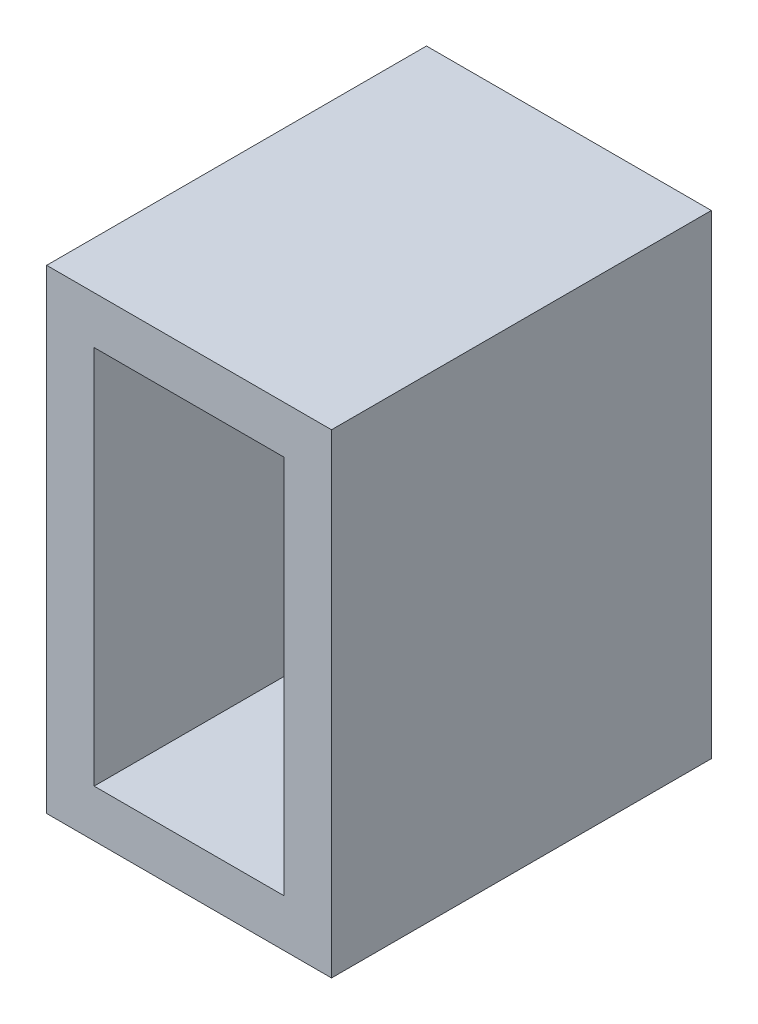
ISO-10303-21;
HEADER;
FILE_DESCRIPTION(('STEP AP214'),'2;1');
FILE_NAME('part.step','',(''),(''),'','','');
FILE_SCHEMA(('AUTOMOTIVE_DESIGN { 1 0 10303 214 1 1 1 1 }'));
ENDSEC;
DATA;
#1=APPLICATION_CONTEXT('core data for automotive mechanical design processes');
#2=APPLICATION_PROTOCOL_DEFINITION('international standard','automotive_design',2000,#1);
#3=PRODUCT_CONTEXT('',#1,'mechanical');
#4=PRODUCT('Part','Part','',(#3));
#5=PRODUCT_RELATED_PRODUCT_CATEGORY('part','',(#4));
#6=PRODUCT_DEFINITION_FORMATION('','',#4);
#7=PRODUCT_DEFINITION_CONTEXT('part definition',#1,'design');
#8=PRODUCT_DEFINITION('design','',#6,#7);
#9=PRODUCT_DEFINITION_SHAPE('','',#8);
#10=(LENGTH_UNIT() NAMED_UNIT(*) SI_UNIT(.MILLI.,.METRE.));
#11=(NAMED_UNIT(*) PLANE_ANGLE_UNIT() SI_UNIT($,.RADIAN.));
#12=(NAMED_UNIT(*) SI_UNIT($,.STERADIAN.) SOLID_ANGLE_UNIT());
#13=UNCERTAINTY_MEASURE_WITH_UNIT(LENGTH_MEASURE(1.E-05),#10,'distance_accuracy_value','');
#14=(GEOMETRIC_REPRESENTATION_CONTEXT(3) GLOBAL_UNCERTAINTY_ASSIGNED_CONTEXT((#13)) GLOBAL_UNIT_ASSIGNED_CONTEXT((#10,
#11,#12)) REPRESENTATION_CONTEXT('',''));
#15=CARTESIAN_POINT('',(0.,0.,0.));
#16=DIRECTION('',(0.,0.,1.));
#17=DIRECTION('',(1.,0.,0.));
#18=AXIS2_PLACEMENT_3D('',#15,#16,#17);
#19=CARTESIAN_POINT('',(0.,0.,5.588));
#20=DIRECTION('',(0.,0.,-1.));
#21=DIRECTION('',(-1.,0.,0.));
#22=AXIS2_PLACEMENT_3D('',#19,#20,#21);
#23=PLANE('',#22);
#24=DIRECTION('',(0.,1.,0.));
#25=VECTOR('',#24,1.);
#26=CARTESIAN_POINT('',(2.83827178729691,-27.627658788774,5.588));
#27=LINE('',#26,#25);
#28=CARTESIAN_POINT('',(2.83827178729691,-27.627658788774,5.588));
#29=VERTEX_POINT('',#28);
#30=CARTESIAN_POINT('',(2.83827178729691,-22.166658788774,5.588));
#31=VERTEX_POINT('',#30);
#32=EDGE_CURVE('E427',#29,#31,#27,.T.);
#33=ORIENTED_EDGE('',*,*,#32,.F.);
#34=DIRECTION('',(-1.,0.,0.));
#35=VECTOR('',#34,1.);
#36=CARTESIAN_POINT('',(0.,-27.627658788774,5.588));
#37=LINE('',#36,#35);
#38=CARTESIAN_POINT('',(-5.67072821270309,-27.627658788774,5.588));
#39=VERTEX_POINT('',#38);
#40=EDGE_CURVE('E264',#29,#39,#37,.T.);
#41=ORIENTED_EDGE('',*,*,#40,.T.);
#42=DIRECTION('',(0.,-1.,0.));
#43=VECTOR('',#42,1.);
#44=CARTESIAN_POINT('',(-5.67072821270309,-27.627658788774,5.588));
#45=LINE('',#44,#43);
#46=CARTESIAN_POINT('',(-5.67072821270309,-22.166658788774,5.588));
#47=VERTEX_POINT('',#46);
#48=EDGE_CURVE('E453',#47,#39,#45,.T.);
#49=ORIENTED_EDGE('',*,*,#48,.F.);
#50=DIRECTION('',(-1.,0.,0.));
#51=VECTOR('',#50,1.);
#52=CARTESIAN_POINT('',(0.,-22.166658788774,5.588));
#53=LINE('',#52,#51);
#54=EDGE_CURVE('E269',#31,#47,#53,.T.);
#55=ORIENTED_EDGE('',*,*,#54,.F.);
#56=EDGE_LOOP('',(#33,#41,#49,#55));
#57=FACE_BOUND('',#56,.T.);
#58=ADVANCED_FACE('F40',(#57),#23,.T.);
#59=DIRECTION('',(0.,1.,0.));
#60=VECTOR('',#59,1.);
#61=CARTESIAN_POINT('',(2.83827178729691,17.711341211226,5.588));
#62=LINE('',#61,#60);
#63=CARTESIAN_POINT('',(2.83827178729691,17.711341211226,5.588));
#64=VERTEX_POINT('',#63);
#65=CARTESIAN_POINT('',(2.83827178729691,23.172341211226,5.588));
#66=VERTEX_POINT('',#65);
#67=EDGE_CURVE('E206',#64,#66,#62,.T.);
#68=ORIENTED_EDGE('',*,*,#67,.F.);
#69=DIRECTION('',(-1.,0.,0.));
#70=VECTOR('',#69,1.);
#71=CARTESIAN_POINT('',(0.,17.711341211226,5.588));
#72=LINE('',#71,#70);
#73=CARTESIAN_POINT('',(-5.67072821270309,17.711341211226,5.588));
#74=VERTEX_POINT('',#73);
#75=EDGE_CURVE('E274',#64,#74,#72,.T.);
#76=ORIENTED_EDGE('',*,*,#75,.T.);
#77=CARTESIAN_POINT('',(-5.67072821270309,23.172341211226,5.588));
#78=VERTEX_POINT('',#77);
#79=EDGE_CURVE('E448',#78,#74,#45,.T.);
#80=ORIENTED_EDGE('',*,*,#79,.F.);
#81=DIRECTION('',(-1.,0.,0.));
#82=VECTOR('',#81,1.);
#83=CARTESIAN_POINT('',(0.,23.172341211226,5.588));
#84=LINE('',#83,#82);
#85=EDGE_CURVE('E263',#66,#78,#84,.T.);
#86=ORIENTED_EDGE('',*,*,#85,.F.);
#87=EDGE_LOOP('',(#68,#76,#80,#86));
#88=FACE_BOUND('',#87,.T.);
#89=ADVANCED_FACE('F491',(#88),#23,.T.);
#90=CARTESIAN_POINT('',(0.,17.711341211226,8.128));
#91=DIRECTION('',(0.,-1.,0.));
#92=DIRECTION('',(0.,0.,-1.));
#93=AXIS2_PLACEMENT_3D('',#90,#91,#92);
#94=PLANE('',#93);
#95=DIRECTION('',(0.,0.,-1.));
#96=VECTOR('',#95,1.);
#97=CARTESIAN_POINT('',(2.83827178729691,17.711341211226,8.128));
#98=LINE('',#97,#96);
#99=CARTESIAN_POINT('',(2.83827178729691,17.711341211226,8.128));
#100=VERTEX_POINT('',#99);
#101=EDGE_CURVE('E414',#100,#64,#98,.T.);
#102=ORIENTED_EDGE('',*,*,#101,.F.);
#103=DIRECTION('',(-1.,0.,0.));
#104=VECTOR('',#103,1.);
#105=CARTESIAN_POINT('',(0.,17.711341211226,8.128));
#106=LINE('',#105,#104);
#107=CARTESIAN_POINT('',(-5.67072821270309,17.711341211226,8.128));
#108=VERTEX_POINT('',#107);
#109=EDGE_CURVE('E220',#100,#108,#106,.T.);
#110=ORIENTED_EDGE('',*,*,#109,.T.);
#111=DIRECTION('',(0.,0.,-1.));
#112=VECTOR('',#111,1.);
#113=CARTESIAN_POINT('',(-5.67072821270309,17.711341211226,8.128));
#114=LINE('',#113,#112);
#115=EDGE_CURVE('E280',#108,#74,#114,.T.);
#116=ORIENTED_EDGE('',*,*,#115,.T.);
#117=ORIENTED_EDGE('',*,*,#75,.F.);
#118=EDGE_LOOP('',(#102,#110,#116,#117));
#119=FACE_BOUND('',#118,.T.);
#120=ADVANCED_FACE('F498',(#119),#94,.T.);
#121=CARTESIAN_POINT('',(0.,-22.166658788774,8.128));
#122=DIRECTION('',(0.,-1.,0.));
#123=DIRECTION('',(0.,0.,-1.));
#124=AXIS2_PLACEMENT_3D('',#121,#122,#123);
#125=PLANE('',#124);
#126=DIRECTION('',(-1.,0.,0.));
#127=VECTOR('',#126,1.);
#128=CARTESIAN_POINT('',(0.,-22.166658788774,8.128));
#129=LINE('',#128,#127);
#130=CARTESIAN_POINT('',(2.83827178729691,-22.166658788774,8.128));
#131=VERTEX_POINT('',#130);
#132=CARTESIAN_POINT('',(-5.67072821270309,-22.166658788774,8.128));
#133=VERTEX_POINT('',#132);
#134=EDGE_CURVE('E246',#131,#133,#129,.T.);
#135=ORIENTED_EDGE('',*,*,#134,.F.);
#136=DIRECTION('',(0.,0.,-1.));
#137=VECTOR('',#136,1.);
#138=CARTESIAN_POINT('',(2.83827178729691,-22.166658788774,8.128));
#139=LINE('',#138,#137);
#140=EDGE_CURVE('E426',#131,#31,#139,.T.);
#141=ORIENTED_EDGE('',*,*,#140,.T.);
#142=ORIENTED_EDGE('',*,*,#54,.T.);
#143=DIRECTION('',(0.,0.,-1.));
#144=VECTOR('',#143,1.);
#145=CARTESIAN_POINT('',(-5.67072821270309,-22.166658788774,8.128));
#146=LINE('',#145,#144);
#147=EDGE_CURVE('E258',#133,#47,#146,.T.);
#148=ORIENTED_EDGE('',*,*,#147,.F.);
#149=EDGE_LOOP('',(#135,#141,#142,#148));
#150=FACE_BOUND('',#149,.T.);
#151=ADVANCED_FACE('F508',(#150),#125,.F.);
#152=CARTESIAN_POINT('',(0.,0.,8.128));
#153=DIRECTION('',(0.,0.,-1.));
#154=DIRECTION('',(-1.,0.,0.));
#155=AXIS2_PLACEMENT_3D('',#152,#153,#154);
#156=PLANE('',#155);
#157=ORIENTED_EDGE('',*,*,#109,.F.);
#158=DIRECTION('',(0.,1.,0.));
#159=VECTOR('',#158,1.);
#160=CARTESIAN_POINT('',(2.83827178729691,17.711341211226,8.128));
#161=LINE('',#160,#159);
#162=CARTESIAN_POINT('',(2.83827178729691,23.172341211226,8.128));
#163=VERTEX_POINT('',#162);
#164=EDGE_CURVE('E203',#100,#163,#161,.T.);
#165=ORIENTED_EDGE('',*,*,#164,.T.);
#166=DIRECTION('',(-1.,0.,0.));
#167=VECTOR('',#166,1.);
#168=CARTESIAN_POINT('',(0.,23.172341211226,8.128));
#169=LINE('',#168,#167);
#170=CARTESIAN_POINT('',(-8.5917282127031,23.172341211226,8.128));
#171=VERTEX_POINT('',#170);
#172=EDGE_CURVE('E217',#163,#171,#169,.T.);
#173=ORIENTED_EDGE('',*,*,#172,.T.);
#174=DIRECTION('',(0.,-1.,0.));
#175=VECTOR('',#174,1.);
#176=CARTESIAN_POINT('',(-8.5917282127031,0.,8.128));
#177=LINE('',#176,#175);
#178=CARTESIAN_POINT('',(-8.5917282127031,-27.627658788774,8.128));
#179=VERTEX_POINT('',#178);
#180=EDGE_CURVE('E230',#171,#179,#177,.T.);
#181=ORIENTED_EDGE('',*,*,#180,.T.);
#182=DIRECTION('',(-1.,0.,0.));
#183=VECTOR('',#182,1.);
#184=CARTESIAN_POINT('',(0.,-27.627658788774,8.128));
#185=LINE('',#184,#183);
#186=CARTESIAN_POINT('',(2.83827178729691,-27.627658788774,8.128));
#187=VERTEX_POINT('',#186);
#188=EDGE_CURVE('E279',#187,#179,#185,.T.);
#189=ORIENTED_EDGE('',*,*,#188,.F.);
#190=DIRECTION('',(0.,1.,0.));
#191=VECTOR('',#190,1.);
#192=CARTESIAN_POINT('',(2.83827178729691,-27.627658788774,8.128));
#193=LINE('',#192,#191);
#194=EDGE_CURVE('E418',#187,#131,#193,.T.);
#195=ORIENTED_EDGE('',*,*,#194,.T.);
#196=ORIENTED_EDGE('',*,*,#134,.T.);
#197=DIRECTION('',(0.,1.,0.));
#198=VECTOR('',#197,1.);
#199=CARTESIAN_POINT('',(-5.67072821270309,0.,8.128));
#200=LINE('',#199,#198);
#201=EDGE_CURVE('E243',#133,#108,#200,.T.);
#202=ORIENTED_EDGE('',*,*,#201,.T.);
#203=EDGE_LOOP('',(#157,#165,#173,#181,#189,#195,#196,#202));
#204=FACE_BOUND('',#203,.T.);
#205=ADVANCED_FACE('F215',(#204),#156,.F.);
#206=DIRECTION('',(0.,-1.,0.));
#207=VECTOR('',#206,1.);
#208=CARTESIAN_POINT('',(5.37827178729691,-27.627658788774,5.588));
#209=LINE('',#208,#207);
#210=CARTESIAN_POINT('',(5.37827178729691,-22.166658788774,5.588));
#211=VERTEX_POINT('',#210);
#212=CARTESIAN_POINT('',(5.37827178729691,-27.627658788774,5.588));
#213=VERTEX_POINT('',#212);
#214=EDGE_CURVE('E423',#211,#213,#209,.T.);
#215=ORIENTED_EDGE('',*,*,#214,.F.);
#216=CARTESIAN_POINT('',(13.8872717872969,-22.166658788774,5.588));
#217=VERTEX_POINT('',#216);
#218=EDGE_CURVE('E270',#217,#211,#53,.T.);
#219=ORIENTED_EDGE('',*,*,#218,.F.);
#220=DIRECTION('',(0.,1.,0.));
#221=VECTOR('',#220,1.);
#222=CARTESIAN_POINT('',(13.8872717872969,-27.627658788774,5.588));
#223=LINE('',#222,#221);
#224=CARTESIAN_POINT('',(13.8872717872969,-27.627658788774,5.588));
#225=VERTEX_POINT('',#224);
#226=EDGE_CURVE('E446',#225,#217,#223,.T.);
#227=ORIENTED_EDGE('',*,*,#226,.F.);
#228=EDGE_CURVE('E259',#225,#213,#37,.T.);
#229=ORIENTED_EDGE('',*,*,#228,.T.);
#230=EDGE_LOOP('',(#215,#219,#227,#229));
#231=FACE_BOUND('',#230,.T.);
#232=ADVANCED_FACE('F488',(#231),#23,.T.);
#233=DIRECTION('',(0.,-1.,0.));
#234=VECTOR('',#233,1.);
#235=CARTESIAN_POINT('',(5.37827178729691,17.711341211226,5.588));
#236=LINE('',#235,#234);
#237=CARTESIAN_POINT('',(5.37827178729691,23.172341211226,5.588));
#238=VERTEX_POINT('',#237);
#239=CARTESIAN_POINT('',(5.37827178729691,17.711341211226,5.588));
#240=VERTEX_POINT('',#239);
#241=EDGE_CURVE('E222',#238,#240,#236,.T.);
#242=ORIENTED_EDGE('',*,*,#241,.F.);
#243=CARTESIAN_POINT('',(13.8872717872969,23.172341211226,5.588));
#244=VERTEX_POINT('',#243);
#245=EDGE_CURVE('E265',#244,#238,#84,.T.);
#246=ORIENTED_EDGE('',*,*,#245,.F.);
#247=DIRECTION('',(0.,-1.,0.));
#248=VECTOR('',#247,1.);
#249=CARTESIAN_POINT('',(13.8872717872969,0.,5.588));
#250=LINE('',#249,#248);
#251=CARTESIAN_POINT('',(13.8872717872969,17.711341211226,5.588));
#252=VERTEX_POINT('',#251);
#253=EDGE_CURVE('E11',#244,#252,#250,.T.);
#254=ORIENTED_EDGE('',*,*,#253,.T.);
#255=EDGE_CURVE('E275',#252,#240,#72,.T.);
#256=ORIENTED_EDGE('',*,*,#255,.T.);
#257=EDGE_LOOP('',(#242,#246,#254,#256));
#258=FACE_BOUND('',#257,.T.);
#259=ADVANCED_FACE('F479',(#258),#23,.T.);
#260=CARTESIAN_POINT('',(-8.5917282127031,23.172341211226,50.8));
#261=DIRECTION('',(1.,0.,0.));
#262=DIRECTION('',(0.,1.,0.));
#263=AXIS2_PLACEMENT_3D('',#260,#261,#262);
#264=PLANE('',#263);
#265=DIRECTION('',(0.,0.,-1.));
#266=VECTOR('',#265,1.);
#267=CARTESIAN_POINT('',(-8.59172821270309,-27.627658788774,50.8));
#268=LINE('',#267,#266);
#269=CARTESIAN_POINT('',(-8.59172821270309,-27.627658788774,50.8));
#270=VERTEX_POINT('',#269);
#271=EDGE_CURVE('E325',#270,#179,#268,.T.);
#272=ORIENTED_EDGE('',*,*,#271,.T.);
#273=ORIENTED_EDGE('',*,*,#180,.F.);
#274=DIRECTION('',(0.,0.,-1.));
#275=VECTOR('',#274,1.);
#276=CARTESIAN_POINT('',(-8.5917282127031,23.172341211226,50.8));
#277=LINE('',#276,#275);
#278=CARTESIAN_POINT('',(-8.5917282127031,23.172341211226,50.8));
#279=VERTEX_POINT('',#278);
#280=EDGE_CURVE('E227',#279,#171,#277,.T.);
#281=ORIENTED_EDGE('',*,*,#280,.F.);
#282=DIRECTION('',(0.,-1.,0.));
#283=VECTOR('',#282,1.);
#284=CARTESIAN_POINT('',(-8.5917282127031,23.172341211226,50.8));
#285=LINE('',#284,#283);
#286=EDGE_CURVE('E296',#279,#270,#285,.T.);
#287=ORIENTED_EDGE('',*,*,#286,.T.);
#288=EDGE_LOOP('',(#272,#273,#281,#287));
#289=FACE_BOUND('',#288,.T.);
#290=ADVANCED_FACE('F477',(#289),#264,.T.);
#291=CARTESIAN_POINT('',(-8.59172821270309,-27.627658788774,50.8));
#292=DIRECTION('',(0.,1.,0.));
#293=DIRECTION('',(0.,0.,1.));
#294=AXIS2_PLACEMENT_3D('',#291,#292,#293);
#295=PLANE('',#294);
#296=DIRECTION('',(0.,0.,-1.));
#297=VECTOR('',#296,1.);
#298=CARTESIAN_POINT('',(16.8082717872969,-27.627658788774,50.8));
#299=LINE('',#298,#297);
#300=CARTESIAN_POINT('',(16.8082717872969,-27.627658788774,50.8));
#301=VERTEX_POINT('',#300);
#302=CARTESIAN_POINT('',(16.8082717872969,-27.627658788774,8.128));
#303=VERTEX_POINT('',#302);
#304=EDGE_CURVE('E321',#301,#303,#299,.T.);
#305=ORIENTED_EDGE('',*,*,#304,.T.);
#306=CARTESIAN_POINT('',(5.37827178729691,-27.627658788774,8.128));
#307=VERTEX_POINT('',#306);
#308=EDGE_CURVE('E236',#303,#307,#185,.T.);
#309=ORIENTED_EDGE('',*,*,#308,.T.);
#310=DIRECTION('',(0.,0.,-1.));
#311=VECTOR('',#310,1.);
#312=CARTESIAN_POINT('',(5.37827178729691,-27.627658788774,8.128));
#313=LINE('',#312,#311);
#314=EDGE_CURVE('E64',#307,#213,#313,.T.);
#315=ORIENTED_EDGE('',*,*,#314,.T.);
#316=ORIENTED_EDGE('',*,*,#228,.F.);
#317=DIRECTION('',(0.,0.,1.));
#318=VECTOR('',#317,1.);
#319=CARTESIAN_POINT('',(13.8872717872969,-27.627658788774,-50.8839094508274));
#320=LINE('',#319,#318);
#321=CARTESIAN_POINT('',(13.8872717872969,-27.627658788774,0.));
#322=VERTEX_POINT('',#321);
#323=EDGE_CURVE('E464',#322,#225,#320,.T.);
#324=ORIENTED_EDGE('',*,*,#323,.F.);
#325=DIRECTION('',(1.,0.,0.));
#326=VECTOR('',#325,1.);
#327=CARTESIAN_POINT('',(-8.59172821270309,-27.627658788774,0.));
#328=LINE('',#327,#326);
#329=CARTESIAN_POINT('',(-5.67072821270309,-27.627658788774,0.));
#330=VERTEX_POINT('',#329);
#331=EDGE_CURVE('E284',#330,#322,#328,.T.);
#332=ORIENTED_EDGE('',*,*,#331,.F.);
#333=DIRECTION('',(0.,0.,1.));
#334=VECTOR('',#333,1.);
#335=CARTESIAN_POINT('',(-5.67072821270309,-27.627658788774,-50.8839094508274));
#336=LINE('',#335,#334);
#337=EDGE_CURVE('E452',#330,#39,#336,.T.);
#338=ORIENTED_EDGE('',*,*,#337,.T.);
#339=ORIENTED_EDGE('',*,*,#40,.F.);
#340=DIRECTION('',(0.,0.,-1.));
#341=VECTOR('',#340,1.);
#342=CARTESIAN_POINT('',(2.83827178729691,-27.627658788774,8.128));
#343=LINE('',#342,#341);
#344=EDGE_CURVE('E432',#187,#29,#343,.T.);
#345=ORIENTED_EDGE('',*,*,#344,.F.);
#346=ORIENTED_EDGE('',*,*,#188,.T.);
#347=ORIENTED_EDGE('',*,*,#271,.F.);
#348=DIRECTION('',(1.,0.,0.));
#349=VECTOR('',#348,1.);
#350=CARTESIAN_POINT('',(-8.59172821270309,-27.627658788774,50.8));
#351=LINE('',#350,#349);
#352=EDGE_CURVE('E299',#270,#301,#351,.T.);
#353=ORIENTED_EDGE('',*,*,#352,.T.);
#354=EDGE_LOOP('',(#305,#309,#315,#316,#324,#332,#338,#339,#345,#346,#347,#353));
#355=FACE_BOUND('',#354,.T.);
#356=ADVANCED_FACE('F399',(#355),#295,.T.);
#357=CARTESIAN_POINT('',(16.8082717872969,23.172341211226,50.8));
#358=DIRECTION('',(-1.,0.,0.));
#359=DIRECTION('',(0.,-1.,0.));
#360=AXIS2_PLACEMENT_3D('',#357,#358,#359);
#361=PLANE('',#360);
#362=DIRECTION('',(0.,0.,-1.));
#363=VECTOR('',#362,1.);
#364=CARTESIAN_POINT('',(16.8082717872969,23.172341211226,50.8));
#365=LINE('',#364,#363);
#366=CARTESIAN_POINT('',(16.8082717872969,23.172341211226,50.8));
#367=VERTEX_POINT('',#366);
#368=CARTESIAN_POINT('',(16.8082717872969,23.172341211226,8.128));
#369=VERTEX_POINT('',#368);
#370=EDGE_CURVE('E317',#367,#369,#365,.T.);
#371=ORIENTED_EDGE('',*,*,#370,.T.);
#372=DIRECTION('',(0.,-1.,0.));
#373=VECTOR('',#372,1.);
#374=CARTESIAN_POINT('',(16.8082717872969,0.,8.128));
#375=LINE('',#374,#373);
#376=EDGE_CURVE('E235',#369,#303,#375,.T.);
#377=ORIENTED_EDGE('',*,*,#376,.T.);
#378=ORIENTED_EDGE('',*,*,#304,.F.);
#379=DIRECTION('',(0.,1.,0.));
#380=VECTOR('',#379,1.);
#381=CARTESIAN_POINT('',(16.8082717872969,23.172341211226,50.8));
#382=LINE('',#381,#380);
#383=EDGE_CURVE('E303',#301,#367,#382,.T.);
#384=ORIENTED_EDGE('',*,*,#383,.T.);
#385=EDGE_LOOP('',(#371,#377,#378,#384));
#386=FACE_BOUND('',#385,.T.);
#387=ADVANCED_FACE('F402',(#386),#361,.T.);
#388=CARTESIAN_POINT('',(-8.5917282127031,23.172341211226,50.8));
#389=DIRECTION('',(0.,-1.,0.));
#390=DIRECTION('',(1.,0.,0.));
#391=AXIS2_PLACEMENT_3D('',#388,#389,#390);
#392=PLANE('',#391);
#393=ORIENTED_EDGE('',*,*,#280,.T.);
#394=ORIENTED_EDGE('',*,*,#172,.F.);
#395=DIRECTION('',(0.,0.,-1.));
#396=VECTOR('',#395,1.);
#397=CARTESIAN_POINT('',(2.83827178729691,23.172341211226,8.128));
#398=LINE('',#397,#396);
#399=EDGE_CURVE('E200',#163,#66,#398,.T.);
#400=ORIENTED_EDGE('',*,*,#399,.T.);
#401=ORIENTED_EDGE('',*,*,#85,.T.);
#402=DIRECTION('',(0.,0.,1.));
#403=VECTOR('',#402,1.);
#404=CARTESIAN_POINT('',(-5.67072821270309,23.172341211226,-50.8839094508274));
#405=LINE('',#404,#403);
#406=CARTESIAN_POINT('',(-5.67072821270309,23.172341211226,0.));
#407=VERTEX_POINT('',#406);
#408=EDGE_CURVE('E447',#407,#78,#405,.T.);
#409=ORIENTED_EDGE('',*,*,#408,.F.);
#410=DIRECTION('',(-1.,0.,0.));
#411=VECTOR('',#410,1.);
#412=CARTESIAN_POINT('',(-8.5917282127031,23.172341211226,0.));
#413=LINE('',#412,#411);
#414=CARTESIAN_POINT('',(13.8872717872969,23.172341211226,0.));
#415=VERTEX_POINT('',#414);
#416=EDGE_CURVE('E300',#415,#407,#413,.T.);
#417=ORIENTED_EDGE('',*,*,#416,.F.);
#418=DIRECTION('',(0.,0.,1.));
#419=VECTOR('',#418,1.);
#420=CARTESIAN_POINT('',(13.8872717872969,23.172341211226,-50.8839094508274));
#421=LINE('',#420,#419);
#422=EDGE_CURVE('E467',#415,#244,#421,.T.);
#423=ORIENTED_EDGE('',*,*,#422,.T.);
#424=ORIENTED_EDGE('',*,*,#245,.T.);
#425=DIRECTION('',(0.,0.,-1.));
#426=VECTOR('',#425,1.);
#427=CARTESIAN_POINT('',(5.37827178729691,23.172341211226,8.128));
#428=LINE('',#427,#426);
#429=CARTESIAN_POINT('',(5.37827178729691,23.172341211226,8.128));
#430=VERTEX_POINT('',#429);
#431=EDGE_CURVE('E211',#430,#238,#428,.T.);
#432=ORIENTED_EDGE('',*,*,#431,.F.);
#433=EDGE_CURVE('E229',#369,#430,#169,.T.);
#434=ORIENTED_EDGE('',*,*,#433,.F.);
#435=ORIENTED_EDGE('',*,*,#370,.F.);
#436=DIRECTION('',(-1.,0.,0.));
#437=VECTOR('',#436,1.);
#438=CARTESIAN_POINT('',(-8.5917282127031,23.172341211226,50.8));
#439=LINE('',#438,#437);
#440=EDGE_CURVE('E307',#367,#279,#439,.T.);
#441=ORIENTED_EDGE('',*,*,#440,.T.);
#442=EDGE_LOOP('',(#393,#394,#400,#401,#409,#417,#423,#424,#432,#434,#435,#441));
#443=FACE_BOUND('',#442,.T.);
#444=ADVANCED_FACE('F225',(#443),#392,.T.);
#445=CARTESIAN_POINT('',(0.,0.,50.8));
#446=DIRECTION('',(0.,0.,1.));
#447=DIRECTION('',(1.,0.,0.));
#448=AXIS2_PLACEMENT_3D('',#445,#446,#447);
#449=PLANE('',#448);
#450=DIRECTION('',(0.,-1.,0.));
#451=VECTOR('',#450,1.);
#452=CARTESIAN_POINT('',(-14.9417282127031,29.522341211226,50.8));
#453=LINE('',#452,#451);
#454=CARTESIAN_POINT('',(-14.9417282127031,29.522341211226,50.8));
#455=VERTEX_POINT('',#454);
#456=CARTESIAN_POINT('',(-14.9417282127031,-33.977658788774,50.8));
#457=VERTEX_POINT('',#456);
#458=EDGE_CURVE('E330',#455,#457,#453,.T.);
#459=ORIENTED_EDGE('',*,*,#458,.T.);
#460=DIRECTION('',(1.,0.,0.));
#461=VECTOR('',#460,1.);
#462=CARTESIAN_POINT('',(-14.9417282127031,-33.977658788774,50.8));
#463=LINE('',#462,#461);
#464=CARTESIAN_POINT('',(23.1582717872969,-33.977658788774,50.8));
#465=VERTEX_POINT('',#464);
#466=EDGE_CURVE('E334',#457,#465,#463,.T.);
#467=ORIENTED_EDGE('',*,*,#466,.T.);
#468=DIRECTION('',(0.,1.,0.));
#469=VECTOR('',#468,1.);
#470=CARTESIAN_POINT('',(23.1582717872969,29.522341211226,50.8));
#471=LINE('',#470,#469);
#472=CARTESIAN_POINT('',(23.1582717872969,29.522341211226,50.8));
#473=VERTEX_POINT('',#472);
#474=EDGE_CURVE('E338',#465,#473,#471,.T.);
#475=ORIENTED_EDGE('',*,*,#474,.T.);
#476=DIRECTION('',(-1.,0.,0.));
#477=VECTOR('',#476,1.);
#478=CARTESIAN_POINT('',(-14.9417282127031,29.522341211226,50.8));
#479=LINE('',#478,#477);
#480=EDGE_CURVE('E341',#473,#455,#479,.T.);
#481=ORIENTED_EDGE('',*,*,#480,.T.);
#482=EDGE_LOOP('',(#459,#467,#475,#481));
#483=FACE_BOUND('',#482,.T.);
#484=ORIENTED_EDGE('',*,*,#352,.F.);
#485=ORIENTED_EDGE('',*,*,#286,.F.);
#486=ORIENTED_EDGE('',*,*,#440,.F.);
#487=ORIENTED_EDGE('',*,*,#383,.F.);
#488=EDGE_LOOP('',(#484,#485,#486,#487));
#489=FACE_BOUND('',#488,.T.);
#490=ADVANCED_FACE('F388',(#483,#489),#449,.T.);
#491=CARTESIAN_POINT('',(0.,0.,0.));
#492=DIRECTION('',(0.,0.,1.));
#493=DIRECTION('',(1.,0.,0.));
#494=AXIS2_PLACEMENT_3D('',#491,#492,#493);
#495=PLANE('',#494);
#496=DIRECTION('',(0.,1.,0.));
#497=VECTOR('',#496,1.);
#498=CARTESIAN_POINT('',(-5.67072821270309,-27.627658788774,0.));
#499=LINE('',#498,#497);
#500=EDGE_CURVE('E443',#330,#407,#499,.T.);
#501=ORIENTED_EDGE('',*,*,#500,.F.);
#502=ORIENTED_EDGE('',*,*,#331,.T.);
#503=DIRECTION('',(0.,-1.,0.));
#504=VECTOR('',#503,1.);
#505=CARTESIAN_POINT('',(13.8872717872969,-27.627658788774,0.));
#506=LINE('',#505,#504);
#507=EDGE_CURVE('E460',#415,#322,#506,.T.);
#508=ORIENTED_EDGE('',*,*,#507,.F.);
#509=ORIENTED_EDGE('',*,*,#416,.T.);
#510=EDGE_LOOP('',(#501,#502,#508,#509));
#511=FACE_BOUND('',#510,.T.);
#512=DIRECTION('',(0.,-1.,0.));
#513=VECTOR('',#512,1.);
#514=CARTESIAN_POINT('',(-14.9417282127031,29.522341211226,0.));
#515=LINE('',#514,#513);
#516=CARTESIAN_POINT('',(-14.9417282127031,29.522341211226,0.));
#517=VERTEX_POINT('',#516);
#518=CARTESIAN_POINT('',(-14.9417282127031,-33.977658788774,0.));
#519=VERTEX_POINT('',#518);
#520=EDGE_CURVE('E329',#517,#519,#515,.T.);
#521=ORIENTED_EDGE('',*,*,#520,.F.);
#522=DIRECTION('',(-1.,0.,0.));
#523=VECTOR('',#522,1.);
#524=CARTESIAN_POINT('',(-14.9417282127031,29.522341211226,0.));
#525=LINE('',#524,#523);
#526=CARTESIAN_POINT('',(23.1582717872969,29.522341211226,0.));
#527=VERTEX_POINT('',#526);
#528=EDGE_CURVE('E335',#527,#517,#525,.T.);
#529=ORIENTED_EDGE('',*,*,#528,.F.);
#530=DIRECTION('',(0.,1.,0.));
#531=VECTOR('',#530,1.);
#532=CARTESIAN_POINT('',(23.1582717872969,29.522341211226,0.));
#533=LINE('',#532,#531);
#534=CARTESIAN_POINT('',(23.1582717872969,-33.977658788774,0.));
#535=VERTEX_POINT('',#534);
#536=EDGE_CURVE('E351',#535,#527,#533,.T.);
#537=ORIENTED_EDGE('',*,*,#536,.F.);
#538=DIRECTION('',(1.,0.,0.));
#539=VECTOR('',#538,1.);
#540=CARTESIAN_POINT('',(-14.9417282127031,-33.977658788774,0.));
#541=LINE('',#540,#539);
#542=EDGE_CURVE('E348',#519,#535,#541,.T.);
#543=ORIENTED_EDGE('',*,*,#542,.F.);
#544=EDGE_LOOP('',(#521,#529,#537,#543));
#545=FACE_BOUND('',#544,.T.);
#546=ADVANCED_FACE('F378',(#511,#545),#495,.F.);
#547=CARTESIAN_POINT('',(-14.9417282127031,29.522341211226,50.8));
#548=DIRECTION('',(1.,0.,0.));
#549=DIRECTION('',(0.,1.,0.));
#550=AXIS2_PLACEMENT_3D('',#547,#548,#549);
#551=PLANE('',#550);
#552=ORIENTED_EDGE('',*,*,#520,.T.);
#553=DIRECTION('',(0.,0.,-1.));
#554=VECTOR('',#553,1.);
#555=CARTESIAN_POINT('',(-14.9417282127031,-33.977658788774,50.8));
#556=LINE('',#555,#554);
#557=EDGE_CURVE('E49',#457,#519,#556,.T.);
#558=ORIENTED_EDGE('',*,*,#557,.F.);
#559=ORIENTED_EDGE('',*,*,#458,.F.);
#560=DIRECTION('',(0.,0.,-1.));
#561=VECTOR('',#560,1.);
#562=CARTESIAN_POINT('',(-14.9417282127031,29.522341211226,50.8));
#563=LINE('',#562,#561);
#564=EDGE_CURVE('E344',#455,#517,#563,.T.);
#565=ORIENTED_EDGE('',*,*,#564,.T.);
#566=EDGE_LOOP('',(#552,#558,#559,#565));
#567=FACE_BOUND('',#566,.T.);
#568=ADVANCED_FACE('F42',(#567),#551,.F.);
#569=CARTESIAN_POINT('',(-14.9417282127031,-33.977658788774,50.8));
#570=DIRECTION('',(0.,1.,0.));
#571=DIRECTION('',(-1.,0.,0.));
#572=AXIS2_PLACEMENT_3D('',#569,#570,#571);
#573=PLANE('',#572);
#574=ORIENTED_EDGE('',*,*,#542,.T.);
#575=DIRECTION('',(0.,0.,-1.));
#576=VECTOR('',#575,1.);
#577=CARTESIAN_POINT('',(23.1582717872969,-33.977658788774,50.8));
#578=LINE('',#577,#576);
#579=EDGE_CURVE('E363',#465,#535,#578,.T.);
#580=ORIENTED_EDGE('',*,*,#579,.F.);
#581=ORIENTED_EDGE('',*,*,#466,.F.);
#582=ORIENTED_EDGE('',*,*,#557,.T.);
#583=EDGE_LOOP('',(#574,#580,#581,#582));
#584=FACE_BOUND('',#583,.T.);
#585=ADVANCED_FACE('F370',(#584),#573,.F.);
#586=CARTESIAN_POINT('',(23.1582717872969,29.522341211226,50.8));
#587=DIRECTION('',(-1.,0.,0.));
#588=DIRECTION('',(0.,-1.,0.));
#589=AXIS2_PLACEMENT_3D('',#586,#587,#588);
#590=PLANE('',#589);
#591=ORIENTED_EDGE('',*,*,#536,.T.);
#592=DIRECTION('',(0.,0.,-1.));
#593=VECTOR('',#592,1.);
#594=CARTESIAN_POINT('',(23.1582717872969,29.522341211226,50.8));
#595=LINE('',#594,#593);
#596=EDGE_CURVE('E359',#473,#527,#595,.T.);
#597=ORIENTED_EDGE('',*,*,#596,.F.);
#598=ORIENTED_EDGE('',*,*,#474,.F.);
#599=ORIENTED_EDGE('',*,*,#579,.T.);
#600=EDGE_LOOP('',(#591,#597,#598,#599));
#601=FACE_BOUND('',#600,.T.);
#602=ADVANCED_FACE('F382',(#601),#590,.F.);
#603=CARTESIAN_POINT('',(-14.9417282127031,29.522341211226,50.8));
#604=DIRECTION('',(0.,-1.,0.));
#605=DIRECTION('',(0.,0.,-1.));
#606=AXIS2_PLACEMENT_3D('',#603,#604,#605);
#607=PLANE('',#606);
#608=ORIENTED_EDGE('',*,*,#528,.T.);
#609=ORIENTED_EDGE('',*,*,#564,.F.);
#610=ORIENTED_EDGE('',*,*,#480,.F.);
#611=ORIENTED_EDGE('',*,*,#596,.T.);
#612=EDGE_LOOP('',(#608,#609,#610,#611));
#613=FACE_BOUND('',#612,.T.);
#614=ADVANCED_FACE('F386',(#613),#607,.F.);
#615=CARTESIAN_POINT('',(-5.67072821270309,0.,8.128));
#616=DIRECTION('',(-1.,0.,0.));
#617=DIRECTION('',(0.,0.,1.));
#618=AXIS2_PLACEMENT_3D('',#615,#616,#617);
#619=PLANE('',#618);
#620=ORIENTED_EDGE('',*,*,#147,.T.);
#621=ORIENTED_EDGE('',*,*,#48,.T.);
#622=ORIENTED_EDGE('',*,*,#337,.F.);
#623=ORIENTED_EDGE('',*,*,#500,.T.);
#624=ORIENTED_EDGE('',*,*,#408,.T.);
#625=ORIENTED_EDGE('',*,*,#79,.T.);
#626=ORIENTED_EDGE('',*,*,#115,.F.);
#627=ORIENTED_EDGE('',*,*,#201,.F.);
#628=EDGE_LOOP('',(#620,#621,#622,#623,#624,#625,#626,#627));
#629=FACE_BOUND('',#628,.T.);
#630=ADVANCED_FACE('F531',(#629),#619,.F.);
#631=DIRECTION('',(0.,0.,-1.));
#632=VECTOR('',#631,1.);
#633=CARTESIAN_POINT('',(5.37827178729691,17.711341211226,8.128));
#634=LINE('',#633,#632);
#635=CARTESIAN_POINT('',(5.37827178729691,17.711341211226,8.128));
#636=VERTEX_POINT('',#635);
#637=EDGE_CURVE('E410',#636,#240,#634,.T.);
#638=ORIENTED_EDGE('',*,*,#637,.T.);
#639=ORIENTED_EDGE('',*,*,#255,.F.);
#640=DIRECTION('',(0.,0.,-1.));
#641=VECTOR('',#640,1.);
#642=CARTESIAN_POINT('',(13.8872717872969,17.711341211226,8.128));
#643=LINE('',#642,#641);
#644=CARTESIAN_POINT('',(13.8872717872969,17.711341211226,8.128));
#645=VERTEX_POINT('',#644);
#646=EDGE_CURVE('E285',#645,#252,#643,.T.);
#647=ORIENTED_EDGE('',*,*,#646,.F.);
#648=EDGE_CURVE('E254',#645,#636,#106,.T.);
#649=ORIENTED_EDGE('',*,*,#648,.T.);
#650=EDGE_LOOP('',(#638,#639,#647,#649));
#651=FACE_BOUND('',#650,.T.);
#652=ADVANCED_FACE('F549',(#651),#94,.T.);
#653=CARTESIAN_POINT('',(13.8872717872969,0.,8.128));
#654=DIRECTION('',(1.,0.,0.));
#655=DIRECTION('',(0.,0.,-1.));
#656=AXIS2_PLACEMENT_3D('',#653,#654,#655);
#657=PLANE('',#656);
#658=ORIENTED_EDGE('',*,*,#646,.T.);
#659=ORIENTED_EDGE('',*,*,#253,.F.);
#660=ORIENTED_EDGE('',*,*,#422,.F.);
#661=ORIENTED_EDGE('',*,*,#507,.T.);
#662=ORIENTED_EDGE('',*,*,#323,.T.);
#663=ORIENTED_EDGE('',*,*,#226,.T.);
#664=DIRECTION('',(0.,0.,-1.));
#665=VECTOR('',#664,1.);
#666=CARTESIAN_POINT('',(13.8872717872969,-22.166658788774,8.128));
#667=LINE('',#666,#665);
#668=CARTESIAN_POINT('',(13.8872717872969,-22.166658788774,8.128));
#669=VERTEX_POINT('',#668);
#670=EDGE_CURVE('E289',#669,#217,#667,.T.);
#671=ORIENTED_EDGE('',*,*,#670,.F.);
#672=DIRECTION('',(0.,-1.,0.));
#673=VECTOR('',#672,1.);
#674=CARTESIAN_POINT('',(13.8872717872969,0.,8.128));
#675=LINE('',#674,#673);
#676=EDGE_CURVE('E251',#645,#669,#675,.T.);
#677=ORIENTED_EDGE('',*,*,#676,.F.);
#678=EDGE_LOOP('',(#658,#659,#660,#661,#662,#663,#671,#677));
#679=FACE_BOUND('',#678,.T.);
#680=ADVANCED_FACE('F520',(#679),#657,.F.);
#681=ORIENTED_EDGE('',*,*,#218,.T.);
#682=DIRECTION('',(0.,0.,-1.));
#683=VECTOR('',#682,1.);
#684=CARTESIAN_POINT('',(5.37827178729691,-22.166658788774,8.128));
#685=LINE('',#684,#683);
#686=CARTESIAN_POINT('',(5.37827178729691,-22.166658788774,8.128));
#687=VERTEX_POINT('',#686);
#688=EDGE_CURVE('E437',#687,#211,#685,.T.);
#689=ORIENTED_EDGE('',*,*,#688,.F.);
#690=EDGE_CURVE('E247',#669,#687,#129,.T.);
#691=ORIENTED_EDGE('',*,*,#690,.F.);
#692=ORIENTED_EDGE('',*,*,#670,.T.);
#693=EDGE_LOOP('',(#681,#689,#691,#692));
#694=FACE_BOUND('',#693,.T.);
#695=ADVANCED_FACE('F515',(#694),#125,.F.);
#696=ORIENTED_EDGE('',*,*,#433,.T.);
#697=DIRECTION('',(0.,-1.,0.));
#698=VECTOR('',#697,1.);
#699=CARTESIAN_POINT('',(5.37827178729691,17.711341211226,8.128));
#700=LINE('',#699,#698);
#701=EDGE_CURVE('E56',#430,#636,#700,.T.);
#702=ORIENTED_EDGE('',*,*,#701,.T.);
#703=ORIENTED_EDGE('',*,*,#648,.F.);
#704=ORIENTED_EDGE('',*,*,#676,.T.);
#705=ORIENTED_EDGE('',*,*,#690,.T.);
#706=DIRECTION('',(0.,-1.,0.));
#707=VECTOR('',#706,1.);
#708=CARTESIAN_POINT('',(5.37827178729691,-27.627658788774,8.128));
#709=LINE('',#708,#707);
#710=EDGE_CURVE('E422',#687,#307,#709,.T.);
#711=ORIENTED_EDGE('',*,*,#710,.T.);
#712=ORIENTED_EDGE('',*,*,#308,.F.);
#713=ORIENTED_EDGE('',*,*,#376,.F.);
#714=EDGE_LOOP('',(#696,#702,#703,#704,#705,#711,#712,#713));
#715=FACE_BOUND('',#714,.T.);
#716=ADVANCED_FACE('F405',(#715),#156,.F.);
#717=CARTESIAN_POINT('',(2.83827178729691,-27.627658788774,8.128));
#718=DIRECTION('',(-1.,0.,0.));
#719=DIRECTION('',(0.,0.,1.));
#720=AXIS2_PLACEMENT_3D('',#717,#718,#719);
#721=PLANE('',#720);
#722=ORIENTED_EDGE('',*,*,#32,.T.);
#723=ORIENTED_EDGE('',*,*,#140,.F.);
#724=ORIENTED_EDGE('',*,*,#194,.F.);
#725=ORIENTED_EDGE('',*,*,#344,.T.);
#726=EDGE_LOOP('',(#722,#723,#724,#725));
#727=FACE_BOUND('',#726,.T.);
#728=ADVANCED_FACE('F562',(#727),#721,.F.);
#729=CARTESIAN_POINT('',(5.37827178729691,-27.627658788774,8.128));
#730=DIRECTION('',(1.,0.,0.));
#731=DIRECTION('',(0.,0.,-1.));
#732=AXIS2_PLACEMENT_3D('',#729,#730,#731);
#733=PLANE('',#732);
#734=ORIENTED_EDGE('',*,*,#214,.T.);
#735=ORIENTED_EDGE('',*,*,#314,.F.);
#736=ORIENTED_EDGE('',*,*,#710,.F.);
#737=ORIENTED_EDGE('',*,*,#688,.T.);
#738=EDGE_LOOP('',(#734,#735,#736,#737));
#739=FACE_BOUND('',#738,.T.);
#740=ADVANCED_FACE('F557',(#739),#733,.F.);
#741=CARTESIAN_POINT('',(2.83827178729691,17.711341211226,8.128));
#742=DIRECTION('',(-1.,0.,0.));
#743=DIRECTION('',(0.,0.,1.));
#744=AXIS2_PLACEMENT_3D('',#741,#742,#743);
#745=PLANE('',#744);
#746=ORIENTED_EDGE('',*,*,#67,.T.);
#747=ORIENTED_EDGE('',*,*,#399,.F.);
#748=ORIENTED_EDGE('',*,*,#164,.F.);
#749=ORIENTED_EDGE('',*,*,#101,.T.);
#750=EDGE_LOOP('',(#746,#747,#748,#749));
#751=FACE_BOUND('',#750,.T.);
#752=ADVANCED_FACE('F202',(#751),#745,.F.);
#753=CARTESIAN_POINT('',(5.37827178729691,17.711341211226,8.128));
#754=DIRECTION('',(1.,0.,0.));
#755=DIRECTION('',(0.,0.,-1.));
#756=AXIS2_PLACEMENT_3D('',#753,#754,#755);
#757=PLANE('',#756);
#758=ORIENTED_EDGE('',*,*,#241,.T.);
#759=ORIENTED_EDGE('',*,*,#637,.F.);
#760=ORIENTED_EDGE('',*,*,#701,.F.);
#761=ORIENTED_EDGE('',*,*,#431,.T.);
#762=EDGE_LOOP('',(#758,#759,#760,#761));
#763=FACE_BOUND('',#762,.T.);
#764=ADVANCED_FACE('F551',(#763),#757,.F.);
#765=CLOSED_SHELL('',(#58,#89,#120,#151,#205,#232,#259,#290,#356,#387,#444,#490,#546,#568,#585,
#602,#614,#630,#652,#680,#695,#716,#728,#740,#752,#764));
#766=MANIFOLD_SOLID_BREP('B2',#765);
#767=ADVANCED_BREP_SHAPE_REPRESENTATION('',(#18,#766),#14);
#768=SHAPE_DEFINITION_REPRESENTATION(#9,#767);
ENDSEC;
END-ISO-10303-21;
